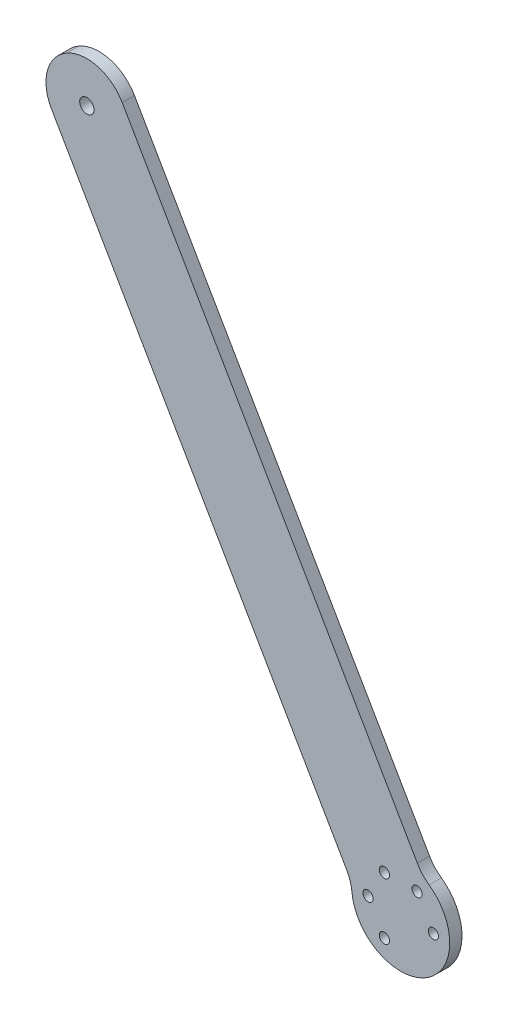
ISO-10303-21;
HEADER;
FILE_DESCRIPTION(('STEP AP214'),'2;1');
FILE_NAME('part.step','',(''),(''),'','','');
FILE_SCHEMA(('AUTOMOTIVE_DESIGN { 1 0 10303 214 1 1 1 1 }'));
ENDSEC;
DATA;
#1=APPLICATION_CONTEXT('core data for automotive mechanical design processes');
#2=APPLICATION_PROTOCOL_DEFINITION('international standard','automotive_design',2000,#1);
#3=PRODUCT_CONTEXT('',#1,'mechanical');
#4=PRODUCT('Part','Part','',(#3));
#5=PRODUCT_RELATED_PRODUCT_CATEGORY('part','',(#4));
#6=PRODUCT_DEFINITION_FORMATION('','',#4);
#7=PRODUCT_DEFINITION_CONTEXT('part definition',#1,'design');
#8=PRODUCT_DEFINITION('design','',#6,#7);
#9=PRODUCT_DEFINITION_SHAPE('','',#8);
#10=(LENGTH_UNIT() NAMED_UNIT(*) SI_UNIT(.MILLI.,.METRE.));
#11=(NAMED_UNIT(*) PLANE_ANGLE_UNIT() SI_UNIT($,.RADIAN.));
#12=(NAMED_UNIT(*) SI_UNIT($,.STERADIAN.) SOLID_ANGLE_UNIT());
#13=UNCERTAINTY_MEASURE_WITH_UNIT(LENGTH_MEASURE(1.E-05),#10,'distance_accuracy_value','');
#14=(GEOMETRIC_REPRESENTATION_CONTEXT(3) GLOBAL_UNCERTAINTY_ASSIGNED_CONTEXT((#13)) GLOBAL_UNIT_ASSIGNED_CONTEXT((#10,
#11,#12)) REPRESENTATION_CONTEXT('',''));
#15=CARTESIAN_POINT('',(0.,0.,0.));
#16=DIRECTION('',(0.,0.,1.));
#17=DIRECTION('',(1.,0.,0.));
#18=AXIS2_PLACEMENT_3D('',#15,#16,#17);
#19=CARTESIAN_POINT('',(-8.66025403784584,-5.00000000000084,3.));
#20=DIRECTION('',(-0.866025403784439,-0.5,0.));
#21=DIRECTION('',(0.5,-0.866025403784439,0.));
#22=AXIS2_PLACEMENT_3D('',#19,#20,#21);
#23=PLANE('',#22);
#24=DIRECTION('',(-0.5,0.866025403784439,0.));
#25=VECTOR('',#24,1.);
#26=CARTESIAN_POINT('',(-8.66025403784584,-5.00000000000084,0.));
#27=LINE('',#26,#25);
#28=CARTESIAN_POINT('',(-13.2428297327999,2.93725393318978,0.));
#29=VERTEX_POINT('',#28);
#30=CARTESIAN_POINT('',(-85.4768788282,128.050297002848,0.));
#31=VERTEX_POINT('',#30);
#32=EDGE_CURVE('E135',#29,#31,#27,.T.);
#33=ORIENTED_EDGE('',*,*,#32,.F.);
#34=DIRECTION('',(0.,0.,-1.));
#35=VECTOR('',#34,1.);
#36=CARTESIAN_POINT('',(-13.2428297327999,2.93725393318978,3.));
#37=LINE('',#36,#35);
#38=CARTESIAN_POINT('',(-13.2428297327999,2.93725393318978,3.));
#39=VERTEX_POINT('',#38);
#40=EDGE_CURVE('E111',#29,#39,#37,.F.);
#41=ORIENTED_EDGE('',*,*,#40,.T.);
#42=DIRECTION('',(-0.5,0.866025403784439,0.));
#43=VECTOR('',#42,1.);
#44=CARTESIAN_POINT('',(-8.66025403784584,-5.00000000000084,3.));
#45=LINE('',#44,#43);
#46=CARTESIAN_POINT('',(-85.4768788282,128.050297002848,3.));
#47=VERTEX_POINT('',#46);
#48=EDGE_CURVE('E217',#39,#47,#45,.T.);
#49=ORIENTED_EDGE('',*,*,#48,.T.);
#50=DIRECTION('',(0.,0.,-1.));
#51=VECTOR('',#50,1.);
#52=CARTESIAN_POINT('',(-85.4768788282,128.050297002847,3.));
#53=LINE('',#52,#51);
#54=EDGE_CURVE('E127',#47,#31,#53,.T.);
#55=ORIENTED_EDGE('',*,*,#54,.T.);
#56=EDGE_LOOP('',(#33,#41,#49,#55));
#57=FACE_BOUND('',#56,.T.);
#58=ADVANCED_FACE('F45',(#57),#23,.T.);
#59=CARTESIAN_POINT('',(0.,0.,3.));
#60=DIRECTION('',(0.,0.,-1.));
#61=DIRECTION('',(-1.,0.,0.));
#62=AXIS2_PLACEMENT_3D('',#59,#60,#61);
#63=CYLINDRICAL_SURFACE('',#62,12.);
#64=CARTESIAN_POINT('',(0.,0.,3.));
#65=DIRECTION('',(0.,0.,1.));
#66=DIRECTION('',(1.,0.,0.));
#67=AXIS2_PLACEMENT_3D('',#64,#65,#66);
#68=CIRCLE('',#67,12.);
#69=CARTESIAN_POINT('',(-11.9471366021696,-1.12513421826012,3.));
#70=VERTEX_POINT('',#69);
#71=CARTESIAN_POINT('',(6.9479631167615,9.78395669083433,3.));
#72=VERTEX_POINT('',#71);
#73=EDGE_CURVE('E125',#70,#72,#68,.T.);
#74=ORIENTED_EDGE('',*,*,#73,.F.);
#75=DIRECTION('',(0.,0.,-1.));
#76=VECTOR('',#75,1.);
#77=CARTESIAN_POINT('',(-11.9471366021696,-1.12513421826012,3.));
#78=LINE('',#77,#76);
#79=CARTESIAN_POINT('',(-11.9471366021696,-1.12513421826012,0.));
#80=VERTEX_POINT('',#79);
#81=EDGE_CURVE('E110',#70,#80,#78,.T.);
#82=ORIENTED_EDGE('',*,*,#81,.T.);
#83=CARTESIAN_POINT('',(0.,0.,0.));
#84=DIRECTION('',(0.,0.,1.));
#85=DIRECTION('',(1.,0.,0.));
#86=AXIS2_PLACEMENT_3D('',#83,#84,#85);
#87=CIRCLE('',#86,12.);
#88=CARTESIAN_POINT('',(6.9479631167615,9.78395669083433,0.));
#89=VERTEX_POINT('',#88);
#90=EDGE_CURVE('E122',#80,#89,#87,.T.);
#91=ORIENTED_EDGE('',*,*,#90,.T.);
#92=DIRECTION('',(0.,0.,-1.));
#93=VECTOR('',#92,1.);
#94=CARTESIAN_POINT('',(6.94796311676151,9.78395669083433,3.));
#95=LINE('',#94,#93);
#96=EDGE_CURVE('E128',#89,#72,#95,.F.);
#97=ORIENTED_EDGE('',*,*,#96,.T.);
#98=EDGE_LOOP('',(#74,#82,#91,#97));
#99=FACE_BOUND('',#98,.T.);
#100=ADVANCED_FACE('F121',(#99),#63,.T.);
#101=CARTESIAN_POINT('',(8.66025403784284,4.99999999999909,3.));
#102=DIRECTION('',(0.866025403784439,0.499999999999999,0.));
#103=DIRECTION('',(-0.499999999999999,0.866025403784439,0.));
#104=AXIS2_PLACEMENT_3D('',#101,#102,#103);
#105=PLANE('',#104);
#106=DIRECTION('',(0.499999999999999,-0.866025403784439,0.));
#107=VECTOR('',#106,1.);
#108=CARTESIAN_POINT('',(8.66025403784284,4.99999999999909,3.));
#109=LINE('',#108,#107);
#110=CARTESIAN_POINT('',(-68.1563707525112,138.050297002848,3.));
#111=VERTEX_POINT('',#110);
#112=CARTESIAN_POINT('',(4.07767834288504,12.9372539331963,3.));
#113=VERTEX_POINT('',#112);
#114=EDGE_CURVE('E211',#111,#113,#109,.T.);
#115=ORIENTED_EDGE('',*,*,#114,.T.);
#116=DIRECTION('',(0.,0.,-1.));
#117=VECTOR('',#116,1.);
#118=CARTESIAN_POINT('',(4.07767834288504,12.9372539331963,3.));
#119=LINE('',#118,#117);
#120=CARTESIAN_POINT('',(4.07767834288504,12.9372539331963,0.));
#121=VERTEX_POINT('',#120);
#122=EDGE_CURVE('E176',#113,#121,#119,.T.);
#123=ORIENTED_EDGE('',*,*,#122,.T.);
#124=DIRECTION('',(0.499999999999999,-0.866025403784439,0.));
#125=VECTOR('',#124,1.);
#126=CARTESIAN_POINT('',(8.66025403784284,4.99999999999909,0.));
#127=LINE('',#126,#125);
#128=CARTESIAN_POINT('',(-68.1563707525112,138.050297002848,0.));
#129=VERTEX_POINT('',#128);
#130=EDGE_CURVE('E134',#129,#121,#127,.T.);
#131=ORIENTED_EDGE('',*,*,#130,.F.);
#132=DIRECTION('',(0.,0.,-1.));
#133=VECTOR('',#132,1.);
#134=CARTESIAN_POINT('',(-68.1563707525112,138.050297002848,3.));
#135=LINE('',#134,#133);
#136=EDGE_CURVE('E173',#129,#111,#135,.F.);
#137=ORIENTED_EDGE('',*,*,#136,.T.);
#138=EDGE_LOOP('',(#115,#123,#131,#137));
#139=FACE_BOUND('',#138,.T.);
#140=ADVANCED_FACE('F240',(#139),#105,.T.);
#141=CARTESIAN_POINT('',(3.99999999999878,6.92820323027427,3.));
#142=DIRECTION('',(0.,0.,-1.));
#143=DIRECTION('',(-1.,0.,0.));
#144=AXIS2_PLACEMENT_3D('',#141,#142,#143);
#145=CYLINDRICAL_SURFACE('',#144,1.25000000000208);
#146=CARTESIAN_POINT('',(3.99999999999878,6.92820323027427,3.));
#147=DIRECTION('',(0.,0.,1.));
#148=DIRECTION('',(1.,0.,0.));
#149=AXIS2_PLACEMENT_3D('',#146,#147,#148);
#150=CIRCLE('',#149,1.25000000000208);
#151=CARTESIAN_POINT('',(5.25000000000086,6.92820323027427,3.));
#152=VERTEX_POINT('',#151);
#153=EDGE_CURVE('E195',#152,#152,#150,.T.);
#154=ORIENTED_EDGE('',*,*,#153,.T.);
#155=EDGE_LOOP('',(#154));
#156=FACE_BOUND('',#155,.T.);
#157=CARTESIAN_POINT('',(3.99999999999878,6.92820323027427,0.));
#158=DIRECTION('',(0.,0.,1.));
#159=DIRECTION('',(1.,0.,0.));
#160=AXIS2_PLACEMENT_3D('',#157,#158,#159);
#161=CIRCLE('',#160,1.25000000000208);
#162=CARTESIAN_POINT('',(5.25000000000086,6.92820323027427,0.));
#163=VERTEX_POINT('',#162);
#164=EDGE_CURVE('E156',#163,#163,#161,.T.);
#165=ORIENTED_EDGE('',*,*,#164,.F.);
#166=EDGE_LOOP('',(#165));
#167=FACE_BOUND('',#166,.T.);
#168=ADVANCED_FACE('F326',(#156,#167),#145,.F.);
#169=CARTESIAN_POINT('',(-4.00000000000122,6.92820323027427,3.));
#170=DIRECTION('',(0.,0.,-1.));
#171=DIRECTION('',(-1.,0.,0.));
#172=AXIS2_PLACEMENT_3D('',#169,#170,#171);
#173=CYLINDRICAL_SURFACE('',#172,1.25000000000208);
#174=CARTESIAN_POINT('',(-4.00000000000122,6.92820323027427,3.));
#175=DIRECTION('',(0.,0.,1.));
#176=DIRECTION('',(1.,0.,0.));
#177=AXIS2_PLACEMENT_3D('',#174,#175,#176);
#178=CIRCLE('',#177,1.25000000000208);
#179=CARTESIAN_POINT('',(-2.74999999999914,6.92820323027427,3.));
#180=VERTEX_POINT('',#179);
#181=EDGE_CURVE('E199',#180,#180,#178,.T.);
#182=ORIENTED_EDGE('',*,*,#181,.T.);
#183=EDGE_LOOP('',(#182));
#184=FACE_BOUND('',#183,.T.);
#185=CARTESIAN_POINT('',(-4.00000000000122,6.92820323027427,0.));
#186=DIRECTION('',(0.,0.,1.));
#187=DIRECTION('',(1.,0.,0.));
#188=AXIS2_PLACEMENT_3D('',#185,#186,#187);
#189=CIRCLE('',#188,1.25000000000208);
#190=CARTESIAN_POINT('',(-2.74999999999914,6.92820323027427,0.));
#191=VERTEX_POINT('',#190);
#192=EDGE_CURVE('E152',#191,#191,#189,.T.);
#193=ORIENTED_EDGE('',*,*,#192,.F.);
#194=EDGE_LOOP('',(#193));
#195=FACE_BOUND('',#194,.T.);
#196=ADVANCED_FACE('F318',(#184,#195),#173,.F.);
#197=CARTESIAN_POINT('',(-8.00000000000122,-1.24046012462747E-12,3.));
#198=DIRECTION('',(0.,0.,-1.));
#199=DIRECTION('',(-1.,0.,0.));
#200=AXIS2_PLACEMENT_3D('',#197,#198,#199);
#201=CYLINDRICAL_SURFACE('',#200,1.25000000000208);
#202=CARTESIAN_POINT('',(-8.00000000000122,-1.24046012462747E-12,3.));
#203=DIRECTION('',(0.,0.,1.));
#204=DIRECTION('',(1.,0.,0.));
#205=AXIS2_PLACEMENT_3D('',#202,#203,#204);
#206=CIRCLE('',#205,1.25000000000208);
#207=CARTESIAN_POINT('',(-6.74999999999914,-1.24046012462747E-12,3.));
#208=VERTEX_POINT('',#207);
#209=EDGE_CURVE('E203',#208,#208,#206,.T.);
#210=ORIENTED_EDGE('',*,*,#209,.T.);
#211=EDGE_LOOP('',(#210));
#212=FACE_BOUND('',#211,.T.);
#213=CARTESIAN_POINT('',(-8.00000000000122,-1.24046012462747E-12,0.));
#214=DIRECTION('',(0.,0.,1.));
#215=DIRECTION('',(1.,0.,0.));
#216=AXIS2_PLACEMENT_3D('',#213,#214,#215);
#217=CIRCLE('',#216,1.25000000000208);
#218=CARTESIAN_POINT('',(-6.74999999999914,-1.24046012462747E-12,0.));
#219=VERTEX_POINT('',#218);
#220=EDGE_CURVE('E148',#219,#219,#217,.T.);
#221=ORIENTED_EDGE('',*,*,#220,.F.);
#222=EDGE_LOOP('',(#221));
#223=FACE_BOUND('',#222,.T.);
#224=ADVANCED_FACE('F310',(#212,#223),#201,.F.);
#225=CARTESIAN_POINT('',(-4.00000000000122,-6.92820323027675,3.));
#226=DIRECTION('',(0.,0.,-1.));
#227=DIRECTION('',(-1.,0.,0.));
#228=AXIS2_PLACEMENT_3D('',#225,#226,#227);
#229=CYLINDRICAL_SURFACE('',#228,1.25000000000209);
#230=CARTESIAN_POINT('',(-4.00000000000122,-6.92820323027675,3.));
#231=DIRECTION('',(0.,0.,1.));
#232=DIRECTION('',(1.,0.,0.));
#233=AXIS2_PLACEMENT_3D('',#230,#231,#232);
#234=CIRCLE('',#233,1.25000000000209);
#235=CARTESIAN_POINT('',(-2.74999999999914,-6.92820323027675,3.));
#236=VERTEX_POINT('',#235);
#237=EDGE_CURVE('E207',#236,#236,#234,.T.);
#238=ORIENTED_EDGE('',*,*,#237,.T.);
#239=EDGE_LOOP('',(#238));
#240=FACE_BOUND('',#239,.T.);
#241=CARTESIAN_POINT('',(-4.00000000000122,-6.92820323027675,0.));
#242=DIRECTION('',(0.,0.,1.));
#243=DIRECTION('',(1.,0.,0.));
#244=AXIS2_PLACEMENT_3D('',#241,#242,#243);
#245=CIRCLE('',#244,1.25000000000209);
#246=CARTESIAN_POINT('',(-2.74999999999914,-6.92820323027675,0.));
#247=VERTEX_POINT('',#246);
#248=EDGE_CURVE('E139',#247,#247,#245,.T.);
#249=ORIENTED_EDGE('',*,*,#248,.F.);
#250=EDGE_LOOP('',(#249));
#251=FACE_BOUND('',#250,.T.);
#252=ADVANCED_FACE('F261',(#240,#251),#229,.F.);
#253=CARTESIAN_POINT('',(-76.8166247903554,133.050297002848,3.));
#254=DIRECTION('',(0.,0.,-1.));
#255=DIRECTION('',(-1.,0.,0.));
#256=AXIS2_PLACEMENT_3D('',#253,#254,#255);
#257=CYLINDRICAL_SURFACE('',#256,1.74999999999999);
#258=CARTESIAN_POINT('',(-76.8166247903554,133.050297002848,3.));
#259=DIRECTION('',(0.,0.,1.));
#260=DIRECTION('',(1.,0.,0.));
#261=AXIS2_PLACEMENT_3D('',#258,#259,#260);
#262=CIRCLE('',#261,1.74999999999999);
#263=CARTESIAN_POINT('',(-75.0666247903555,133.050297002848,3.));
#264=VERTEX_POINT('',#263);
#265=EDGE_CURVE('E164',#264,#264,#262,.T.);
#266=ORIENTED_EDGE('',*,*,#265,.T.);
#267=EDGE_LOOP('',(#266));
#268=FACE_BOUND('',#267,.T.);
#269=CARTESIAN_POINT('',(-76.8166247903554,133.050297002848,0.));
#270=DIRECTION('',(0.,0.,1.));
#271=DIRECTION('',(1.,0.,0.));
#272=AXIS2_PLACEMENT_3D('',#269,#270,#271);
#273=CIRCLE('',#272,1.74999999999999);
#274=CARTESIAN_POINT('',(-75.0666247903555,133.050297002848,0.));
#275=VERTEX_POINT('',#274);
#276=EDGE_CURVE('E141',#275,#275,#273,.T.);
#277=ORIENTED_EDGE('',*,*,#276,.F.);
#278=EDGE_LOOP('',(#277));
#279=FACE_BOUND('',#278,.T.);
#280=ADVANCED_FACE('F257',(#268,#279),#257,.F.);
#281=CARTESIAN_POINT('',(7.99999999999878,-1.25095173221018E-12,3.));
#282=DIRECTION('',(0.,0.,-1.));
#283=DIRECTION('',(-1.,0.,0.));
#284=AXIS2_PLACEMENT_3D('',#281,#282,#283);
#285=CYLINDRICAL_SURFACE('',#284,1.25000000000208);
#286=CARTESIAN_POINT('',(7.99999999999878,-1.25095173221018E-12,3.));
#287=DIRECTION('',(0.,0.,1.));
#288=DIRECTION('',(1.,0.,0.));
#289=AXIS2_PLACEMENT_3D('',#286,#287,#288);
#290=CIRCLE('',#289,1.25000000000208);
#291=CARTESIAN_POINT('',(9.25000000000086,-1.25095173221018E-12,3.));
#292=VERTEX_POINT('',#291);
#293=EDGE_CURVE('E166',#292,#292,#290,.T.);
#294=ORIENTED_EDGE('',*,*,#293,.T.);
#295=EDGE_LOOP('',(#294));
#296=FACE_BOUND('',#295,.T.);
#297=CARTESIAN_POINT('',(7.99999999999878,-1.25095173221018E-12,0.));
#298=DIRECTION('',(0.,0.,1.));
#299=DIRECTION('',(1.,0.,0.));
#300=AXIS2_PLACEMENT_3D('',#297,#298,#299);
#301=CIRCLE('',#300,1.25000000000208);
#302=CARTESIAN_POINT('',(9.25000000000086,-1.25095173221018E-12,0.));
#303=VERTEX_POINT('',#302);
#304=EDGE_CURVE('E160',#303,#303,#301,.T.);
#305=ORIENTED_EDGE('',*,*,#304,.F.);
#306=EDGE_LOOP('',(#305));
#307=FACE_BOUND('',#306,.T.);
#308=ADVANCED_FACE('F260',(#296,#307),#285,.F.);
#309=CARTESIAN_POINT('',(0.,0.,3.));
#310=DIRECTION('',(0.,0.,1.));
#311=DIRECTION('',(1.,0.,0.));
#312=AXIS2_PLACEMENT_3D('',#309,#310,#311);
#313=PLANE('',#312);
#314=ORIENTED_EDGE('',*,*,#265,.F.);
#315=EDGE_LOOP('',(#314));
#316=FACE_BOUND('',#315,.T.);
#317=CARTESIAN_POINT('',(-76.8166247903556,133.050297002848,3.));
#318=DIRECTION('',(0.,0.,1.));
#319=DIRECTION('',(1.,0.,0.));
#320=AXIS2_PLACEMENT_3D('',#317,#318,#319);
#321=CIRCLE('',#320,10.);
#322=CARTESIAN_POINT('',(-81.8166247903556,141.710551040692,3.));
#323=VERTEX_POINT('',#322);
#324=EDGE_CURVE('E62',#111,#323,#321,.T.);
#325=ORIENTED_EDGE('',*,*,#324,.T.);
#326=CARTESIAN_POINT('',(-76.8166247903556,133.050297002848,3.));
#327=DIRECTION('',(0.,0.,1.));
#328=DIRECTION('',(1.,0.,0.));
#329=AXIS2_PLACEMENT_3D('',#326,#327,#328);
#330=CIRCLE('',#329,10.);
#331=EDGE_CURVE('E116',#323,#47,#330,.T.);
#332=ORIENTED_EDGE('',*,*,#331,.T.);
#333=ORIENTED_EDGE('',*,*,#48,.F.);
#334=CARTESIAN_POINT('',(-21.9030837706442,-2.06274606681022,3.));
#335=DIRECTION('',(0.,0.,1.));
#336=DIRECTION('',(1.,0.,0.));
#337=AXIS2_PLACEMENT_3D('',#334,#335,#336);
#338=CIRCLE('',#337,10.);
#339=EDGE_CURVE('E115',#39,#70,#338,.F.);
#340=ORIENTED_EDGE('',*,*,#339,.T.);
#341=ORIENTED_EDGE('',*,*,#73,.T.);
#342=CARTESIAN_POINT('',(12.7379323807294,17.9372539331963,3.));
#343=DIRECTION('',(0.,0.,1.));
#344=DIRECTION('',(1.,0.,0.));
#345=AXIS2_PLACEMENT_3D('',#342,#343,#344);
#346=CIRCLE('',#345,10.);
#347=EDGE_CURVE('E11',#72,#113,#346,.F.);
#348=ORIENTED_EDGE('',*,*,#347,.T.);
#349=ORIENTED_EDGE('',*,*,#114,.F.);
#350=EDGE_LOOP('',(#325,#332,#333,#340,#341,#348,#349));
#351=FACE_BOUND('',#350,.T.);
#352=ORIENTED_EDGE('',*,*,#237,.F.);
#353=EDGE_LOOP('',(#352));
#354=FACE_BOUND('',#353,.T.);
#355=ORIENTED_EDGE('',*,*,#209,.F.);
#356=EDGE_LOOP('',(#355));
#357=FACE_BOUND('',#356,.T.);
#358=ORIENTED_EDGE('',*,*,#181,.F.);
#359=EDGE_LOOP('',(#358));
#360=FACE_BOUND('',#359,.T.);
#361=ORIENTED_EDGE('',*,*,#153,.F.);
#362=EDGE_LOOP('',(#361));
#363=FACE_BOUND('',#362,.T.);
#364=ORIENTED_EDGE('',*,*,#293,.F.);
#365=EDGE_LOOP('',(#364));
#366=FACE_BOUND('',#365,.T.);
#367=ADVANCED_FACE('F245',(#316,#351,#354,#357,#360,#363,#366),#313,.T.);
#368=CARTESIAN_POINT('',(0.,0.,0.));
#369=DIRECTION('',(0.,0.,1.));
#370=DIRECTION('',(1.,0.,0.));
#371=AXIS2_PLACEMENT_3D('',#368,#369,#370);
#372=PLANE('',#371);
#373=ORIENTED_EDGE('',*,*,#276,.T.);
#374=EDGE_LOOP('',(#373));
#375=FACE_BOUND('',#374,.T.);
#376=ORIENTED_EDGE('',*,*,#32,.T.);
#377=CARTESIAN_POINT('',(-76.8166247903556,133.050297002848,0.));
#378=DIRECTION('',(0.,0.,1.));
#379=DIRECTION('',(1.,0.,0.));
#380=AXIS2_PLACEMENT_3D('',#377,#378,#379);
#381=CIRCLE('',#380,10.);
#382=CARTESIAN_POINT('',(-81.8166247903556,141.710551040692,0.));
#383=VERTEX_POINT('',#382);
#384=EDGE_CURVE('E70',#31,#383,#381,.F.);
#385=ORIENTED_EDGE('',*,*,#384,.T.);
#386=CARTESIAN_POINT('',(-76.8166247903556,133.050297002848,0.));
#387=DIRECTION('',(0.,0.,1.));
#388=DIRECTION('',(1.,0.,0.));
#389=AXIS2_PLACEMENT_3D('',#386,#387,#388);
#390=CIRCLE('',#389,10.);
#391=EDGE_CURVE('E180',#383,#129,#390,.F.);
#392=ORIENTED_EDGE('',*,*,#391,.T.);
#393=ORIENTED_EDGE('',*,*,#130,.T.);
#394=CARTESIAN_POINT('',(12.7379323807294,17.9372539331963,0.));
#395=DIRECTION('',(0.,0.,1.));
#396=DIRECTION('',(1.,0.,0.));
#397=AXIS2_PLACEMENT_3D('',#394,#395,#396);
#398=CIRCLE('',#397,10.);
#399=EDGE_CURVE('E55',#121,#89,#398,.T.);
#400=ORIENTED_EDGE('',*,*,#399,.T.);
#401=ORIENTED_EDGE('',*,*,#90,.F.);
#402=CARTESIAN_POINT('',(-21.9030837706442,-2.06274606681022,0.));
#403=DIRECTION('',(0.,0.,1.));
#404=DIRECTION('',(1.,0.,0.));
#405=AXIS2_PLACEMENT_3D('',#402,#403,#404);
#406=CIRCLE('',#405,10.);
#407=EDGE_CURVE('E106',#80,#29,#406,.T.);
#408=ORIENTED_EDGE('',*,*,#407,.T.);
#409=EDGE_LOOP('',(#376,#385,#392,#393,#400,#401,#408));
#410=FACE_BOUND('',#409,.T.);
#411=ORIENTED_EDGE('',*,*,#248,.T.);
#412=EDGE_LOOP('',(#411));
#413=FACE_BOUND('',#412,.T.);
#414=ORIENTED_EDGE('',*,*,#220,.T.);
#415=EDGE_LOOP('',(#414));
#416=FACE_BOUND('',#415,.T.);
#417=ORIENTED_EDGE('',*,*,#192,.T.);
#418=EDGE_LOOP('',(#417));
#419=FACE_BOUND('',#418,.T.);
#420=ORIENTED_EDGE('',*,*,#164,.T.);
#421=EDGE_LOOP('',(#420));
#422=FACE_BOUND('',#421,.T.);
#423=ORIENTED_EDGE('',*,*,#304,.T.);
#424=EDGE_LOOP('',(#423));
#425=FACE_BOUND('',#424,.T.);
#426=ADVANCED_FACE('F130',(#375,#410,#413,#416,#419,#422,#425),#372,.F.);
#427=CARTESIAN_POINT('',(-21.9030837706442,-2.06274606681022,3.));
#428=DIRECTION('',(0.,0.,-1.));
#429=DIRECTION('',(-1.,0.,0.));
#430=AXIS2_PLACEMENT_3D('',#427,#428,#429);
#431=CYLINDRICAL_SURFACE('',#430,10.);
#432=ORIENTED_EDGE('',*,*,#339,.F.);
#433=ORIENTED_EDGE('',*,*,#40,.F.);
#434=ORIENTED_EDGE('',*,*,#407,.F.);
#435=ORIENTED_EDGE('',*,*,#81,.F.);
#436=EDGE_LOOP('',(#432,#433,#434,#435));
#437=FACE_BOUND('',#436,.T.);
#438=ADVANCED_FACE('F109',(#437),#431,.F.);
#439=CARTESIAN_POINT('',(12.7379323807294,17.9372539331963,3.));
#440=DIRECTION('',(0.,0.,-1.));
#441=DIRECTION('',(-1.,0.,0.));
#442=AXIS2_PLACEMENT_3D('',#439,#440,#441);
#443=CYLINDRICAL_SURFACE('',#442,10.);
#444=ORIENTED_EDGE('',*,*,#347,.F.);
#445=ORIENTED_EDGE('',*,*,#96,.F.);
#446=ORIENTED_EDGE('',*,*,#399,.F.);
#447=ORIENTED_EDGE('',*,*,#122,.F.);
#448=EDGE_LOOP('',(#444,#445,#446,#447));
#449=FACE_BOUND('',#448,.T.);
#450=ADVANCED_FACE('F244',(#449),#443,.F.);
#451=CARTESIAN_POINT('',(-76.8166247903556,133.050297002848,3.));
#452=DIRECTION('',(0.,0.,-1.));
#453=DIRECTION('',(-1.,0.,0.));
#454=AXIS2_PLACEMENT_3D('',#451,#452,#453);
#455=CYLINDRICAL_SURFACE('',#454,10.);
#456=DIRECTION('',(0.,0.,-1.));
#457=VECTOR('',#456,1.);
#458=CARTESIAN_POINT('',(-81.8166247903556,141.710551040692,3.));
#459=LINE('',#458,#457);
#460=EDGE_CURVE('E49',#323,#383,#459,.T.);
#461=ORIENTED_EDGE('',*,*,#460,.F.);
#462=ORIENTED_EDGE('',*,*,#324,.F.);
#463=ORIENTED_EDGE('',*,*,#136,.F.);
#464=ORIENTED_EDGE('',*,*,#391,.F.);
#465=EDGE_LOOP('',(#461,#462,#463,#464));
#466=FACE_BOUND('',#465,.T.);
#467=ADVANCED_FACE('F47',(#466),#455,.T.);
#468=CARTESIAN_POINT('',(-76.8166247903556,133.050297002848,3.));
#469=DIRECTION('',(0.,0.,-1.));
#470=DIRECTION('',(-1.,0.,0.));
#471=AXIS2_PLACEMENT_3D('',#468,#469,#470);
#472=CYLINDRICAL_SURFACE('',#471,10.);
#473=ORIENTED_EDGE('',*,*,#331,.F.);
#474=ORIENTED_EDGE('',*,*,#460,.T.);
#475=ORIENTED_EDGE('',*,*,#384,.F.);
#476=ORIENTED_EDGE('',*,*,#54,.F.);
#477=EDGE_LOOP('',(#473,#474,#475,#476));
#478=FACE_BOUND('',#477,.T.);
#479=ADVANCED_FACE('F234',(#478),#472,.T.);
#480=CLOSED_SHELL('',(#58,#100,#140,#168,#196,#224,#252,#280,#308,#367,#426,#438,#450,#467,#479));
#481=MANIFOLD_SOLID_BREP('B2',#480);
#482=ADVANCED_BREP_SHAPE_REPRESENTATION('',(#18,#481),#14);
#483=SHAPE_DEFINITION_REPRESENTATION(#9,#482);
ENDSEC;
END-ISO-10303-21;
